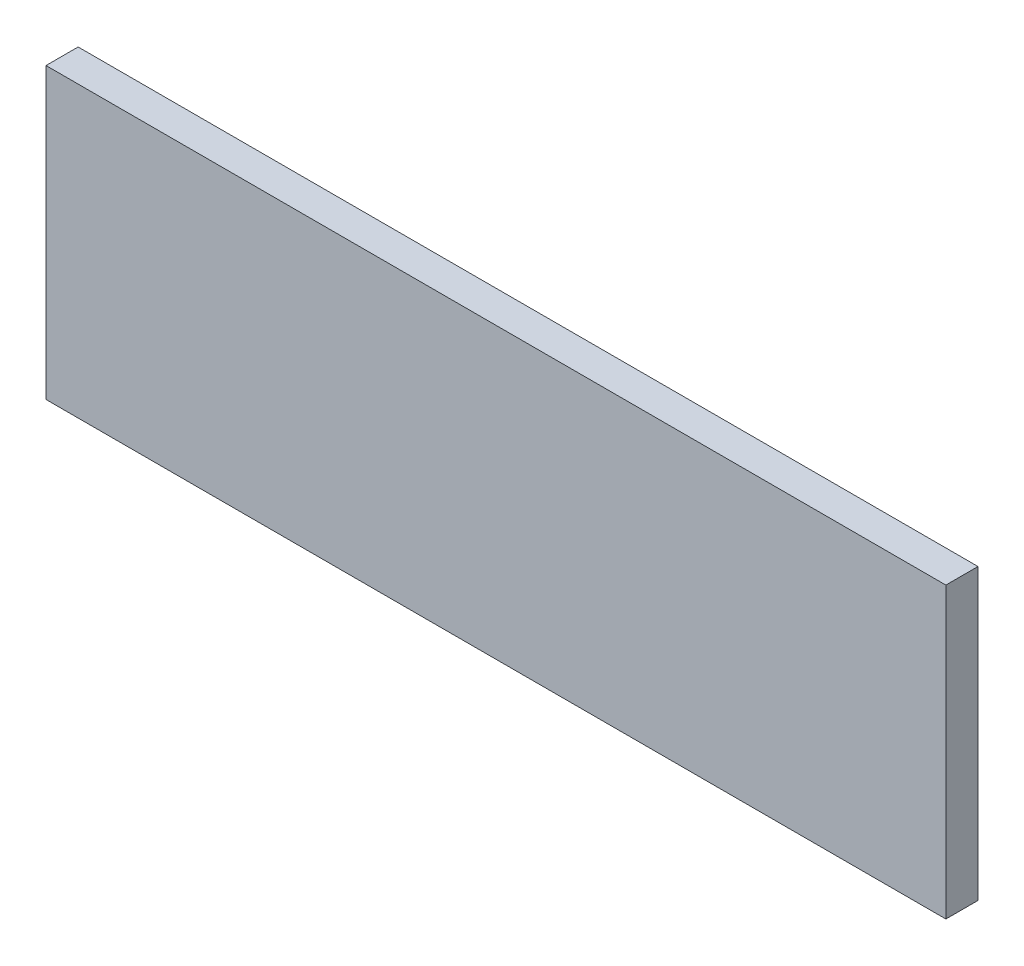
ISO-10303-21;
HEADER;
FILE_DESCRIPTION(('STEP AP214'),'2;1');
FILE_NAME('part.step','',(''),(''),'','','');
FILE_SCHEMA(('AUTOMOTIVE_DESIGN { 1 0 10303 214 1 1 1 1 }'));
ENDSEC;
DATA;
#1=APPLICATION_CONTEXT('core data for automotive mechanical design processes');
#2=APPLICATION_PROTOCOL_DEFINITION('international standard','automotive_design',2000,#1);
#3=PRODUCT_CONTEXT('',#1,'mechanical');
#4=PRODUCT('Part','Part','',(#3));
#5=PRODUCT_RELATED_PRODUCT_CATEGORY('part','',(#4));
#6=PRODUCT_DEFINITION_FORMATION('','',#4);
#7=PRODUCT_DEFINITION_CONTEXT('part definition',#1,'design');
#8=PRODUCT_DEFINITION('design','',#6,#7);
#9=PRODUCT_DEFINITION_SHAPE('','',#8);
#10=(LENGTH_UNIT() NAMED_UNIT(*) SI_UNIT(.MILLI.,.METRE.));
#11=(NAMED_UNIT(*) PLANE_ANGLE_UNIT() SI_UNIT($,.RADIAN.));
#12=(NAMED_UNIT(*) SI_UNIT($,.STERADIAN.) SOLID_ANGLE_UNIT());
#13=UNCERTAINTY_MEASURE_WITH_UNIT(LENGTH_MEASURE(1.E-05),#10,'distance_accuracy_value','');
#14=(GEOMETRIC_REPRESENTATION_CONTEXT(3) GLOBAL_UNCERTAINTY_ASSIGNED_CONTEXT((#13)) GLOBAL_UNIT_ASSIGNED_CONTEXT((#10,
#11,#12)) REPRESENTATION_CONTEXT('',''));
#15=CARTESIAN_POINT('',(0.,0.,0.));
#16=DIRECTION('',(0.,0.,1.));
#17=DIRECTION('',(1.,0.,0.));
#18=AXIS2_PLACEMENT_3D('',#15,#16,#17);
#19=CARTESIAN_POINT('',(0.,0.,12.7));
#20=DIRECTION('',(1.,0.,0.));
#21=DIRECTION('',(0.,0.,-1.));
#22=AXIS2_PLACEMENT_3D('',#19,#20,#21);
#23=PLANE('',#22);
#24=DIRECTION('',(0.,-1.,0.));
#25=VECTOR('',#24,1.);
#26=CARTESIAN_POINT('',(0.,0.,0.));
#27=LINE('',#26,#25);
#28=CARTESIAN_POINT('',(0.,114.3,0.));
#29=VERTEX_POINT('',#28);
#30=CARTESIAN_POINT('',(0.,0.,0.));
#31=VERTEX_POINT('',#30);
#32=EDGE_CURVE('E107',#29,#31,#27,.T.);
#33=ORIENTED_EDGE('',*,*,#32,.T.);
#34=DIRECTION('',(0.,0.,-1.));
#35=VECTOR('',#34,1.);
#36=CARTESIAN_POINT('',(0.,0.,12.7));
#37=LINE('',#36,#35);
#38=CARTESIAN_POINT('',(0.,0.,12.7));
#39=VERTEX_POINT('',#38);
#40=EDGE_CURVE('E11',#39,#31,#37,.T.);
#41=ORIENTED_EDGE('',*,*,#40,.F.);
#42=DIRECTION('',(0.,-1.,0.));
#43=VECTOR('',#42,1.);
#44=CARTESIAN_POINT('',(0.,0.,12.7));
#45=LINE('',#44,#43);
#46=CARTESIAN_POINT('',(0.,114.3,12.7));
#47=VERTEX_POINT('',#46);
#48=EDGE_CURVE('E91',#47,#39,#45,.T.);
#49=ORIENTED_EDGE('',*,*,#48,.F.);
#50=DIRECTION('',(0.,0.,-1.));
#51=VECTOR('',#50,1.);
#52=CARTESIAN_POINT('',(0.,114.3,12.7));
#53=LINE('',#52,#51);
#54=EDGE_CURVE('E103',#47,#29,#53,.T.);
#55=ORIENTED_EDGE('',*,*,#54,.T.);
#56=EDGE_LOOP('',(#33,#41,#49,#55));
#57=FACE_BOUND('',#56,.T.);
#58=ADVANCED_FACE('F39',(#57),#23,.F.);
#59=CARTESIAN_POINT('',(0.,0.,12.7));
#60=DIRECTION('',(0.,1.,0.));
#61=DIRECTION('',(0.,0.,1.));
#62=AXIS2_PLACEMENT_3D('',#59,#60,#61);
#63=PLANE('',#62);
#64=DIRECTION('',(1.,0.,0.));
#65=VECTOR('',#64,1.);
#66=CARTESIAN_POINT('',(0.,0.,0.));
#67=LINE('',#66,#65);
#68=CARTESIAN_POINT('',(355.6,0.,0.));
#69=VERTEX_POINT('',#68);
#70=EDGE_CURVE('E96',#31,#69,#67,.T.);
#71=ORIENTED_EDGE('',*,*,#70,.T.);
#72=DIRECTION('',(0.,0.,-1.));
#73=VECTOR('',#72,1.);
#74=CARTESIAN_POINT('',(355.6,0.,12.7));
#75=LINE('',#74,#73);
#76=CARTESIAN_POINT('',(355.6,0.,12.7));
#77=VERTEX_POINT('',#76);
#78=EDGE_CURVE('E48',#77,#69,#75,.T.);
#79=ORIENTED_EDGE('',*,*,#78,.F.);
#80=DIRECTION('',(1.,0.,0.));
#81=VECTOR('',#80,1.);
#82=CARTESIAN_POINT('',(0.,0.,12.7));
#83=LINE('',#82,#81);
#84=EDGE_CURVE('E86',#39,#77,#83,.T.);
#85=ORIENTED_EDGE('',*,*,#84,.F.);
#86=ORIENTED_EDGE('',*,*,#40,.T.);
#87=EDGE_LOOP('',(#71,#79,#85,#86));
#88=FACE_BOUND('',#87,.T.);
#89=ADVANCED_FACE('F95',(#88),#63,.F.);
#90=CARTESIAN_POINT('',(355.6,0.,12.7));
#91=DIRECTION('',(-1.,0.,0.));
#92=DIRECTION('',(0.,0.,1.));
#93=AXIS2_PLACEMENT_3D('',#90,#91,#92);
#94=PLANE('',#93);
#95=DIRECTION('',(0.,1.,0.));
#96=VECTOR('',#95,1.);
#97=CARTESIAN_POINT('',(355.6,0.,0.));
#98=LINE('',#97,#96);
#99=CARTESIAN_POINT('',(355.6,114.3,0.));
#100=VERTEX_POINT('',#99);
#101=EDGE_CURVE('E73',#69,#100,#98,.T.);
#102=ORIENTED_EDGE('',*,*,#101,.T.);
#103=DIRECTION('',(0.,0.,-1.));
#104=VECTOR('',#103,1.);
#105=CARTESIAN_POINT('',(355.6,114.3,12.7));
#106=LINE('',#105,#104);
#107=CARTESIAN_POINT('',(355.6,114.3,12.7));
#108=VERTEX_POINT('',#107);
#109=EDGE_CURVE('E98',#108,#100,#106,.T.);
#110=ORIENTED_EDGE('',*,*,#109,.F.);
#111=DIRECTION('',(0.,1.,0.));
#112=VECTOR('',#111,1.);
#113=CARTESIAN_POINT('',(355.6,0.,12.7));
#114=LINE('',#113,#112);
#115=EDGE_CURVE('E89',#77,#108,#114,.T.);
#116=ORIENTED_EDGE('',*,*,#115,.F.);
#117=ORIENTED_EDGE('',*,*,#78,.T.);
#118=EDGE_LOOP('',(#102,#110,#116,#117));
#119=FACE_BOUND('',#118,.T.);
#120=ADVANCED_FACE('F99',(#119),#94,.F.);
#121=CARTESIAN_POINT('',(0.,114.3,12.7));
#122=DIRECTION('',(0.,-1.,0.));
#123=DIRECTION('',(0.,0.,-1.));
#124=AXIS2_PLACEMENT_3D('',#121,#122,#123);
#125=PLANE('',#124);
#126=DIRECTION('',(-1.,0.,0.));
#127=VECTOR('',#126,1.);
#128=CARTESIAN_POINT('',(0.,114.3,0.));
#129=LINE('',#128,#127);
#130=EDGE_CURVE('E79',#100,#29,#129,.T.);
#131=ORIENTED_EDGE('',*,*,#130,.T.);
#132=ORIENTED_EDGE('',*,*,#54,.F.);
#133=DIRECTION('',(-1.,0.,0.));
#134=VECTOR('',#133,1.);
#135=CARTESIAN_POINT('',(0.,114.3,12.7));
#136=LINE('',#135,#134);
#137=EDGE_CURVE('E56',#108,#47,#136,.T.);
#138=ORIENTED_EDGE('',*,*,#137,.F.);
#139=ORIENTED_EDGE('',*,*,#109,.T.);
#140=EDGE_LOOP('',(#131,#132,#138,#139));
#141=FACE_BOUND('',#140,.T.);
#142=ADVANCED_FACE('F120',(#141),#125,.F.);
#143=CARTESIAN_POINT('',(0.,0.,12.7));
#144=DIRECTION('',(0.,0.,-1.));
#145=DIRECTION('',(-1.,0.,0.));
#146=AXIS2_PLACEMENT_3D('',#143,#144,#145);
#147=PLANE('',#146);
#148=ORIENTED_EDGE('',*,*,#48,.T.);
#149=ORIENTED_EDGE('',*,*,#84,.T.);
#150=ORIENTED_EDGE('',*,*,#115,.T.);
#151=ORIENTED_EDGE('',*,*,#137,.T.);
#152=EDGE_LOOP('',(#148,#149,#150,#151));
#153=FACE_BOUND('',#152,.T.);
#154=ADVANCED_FACE('F87',(#153),#147,.F.);
#155=CARTESIAN_POINT('',(0.,0.,0.));
#156=DIRECTION('',(0.,0.,-1.));
#157=DIRECTION('',(-1.,0.,0.));
#158=AXIS2_PLACEMENT_3D('',#155,#156,#157);
#159=PLANE('',#158);
#160=ORIENTED_EDGE('',*,*,#32,.F.);
#161=ORIENTED_EDGE('',*,*,#130,.F.);
#162=ORIENTED_EDGE('',*,*,#101,.F.);
#163=ORIENTED_EDGE('',*,*,#70,.F.);
#164=EDGE_LOOP('',(#160,#161,#162,#163));
#165=FACE_BOUND('',#164,.T.);
#166=ADVANCED_FACE('F123',(#165),#159,.T.);
#167=CLOSED_SHELL('',(#58,#89,#120,#142,#154,#166));
#168=MANIFOLD_SOLID_BREP('B2',#167);
#169=ADVANCED_BREP_SHAPE_REPRESENTATION('',(#18,#168),#14);
#170=SHAPE_DEFINITION_REPRESENTATION(#9,#169);
ENDSEC;
END-ISO-10303-21;
